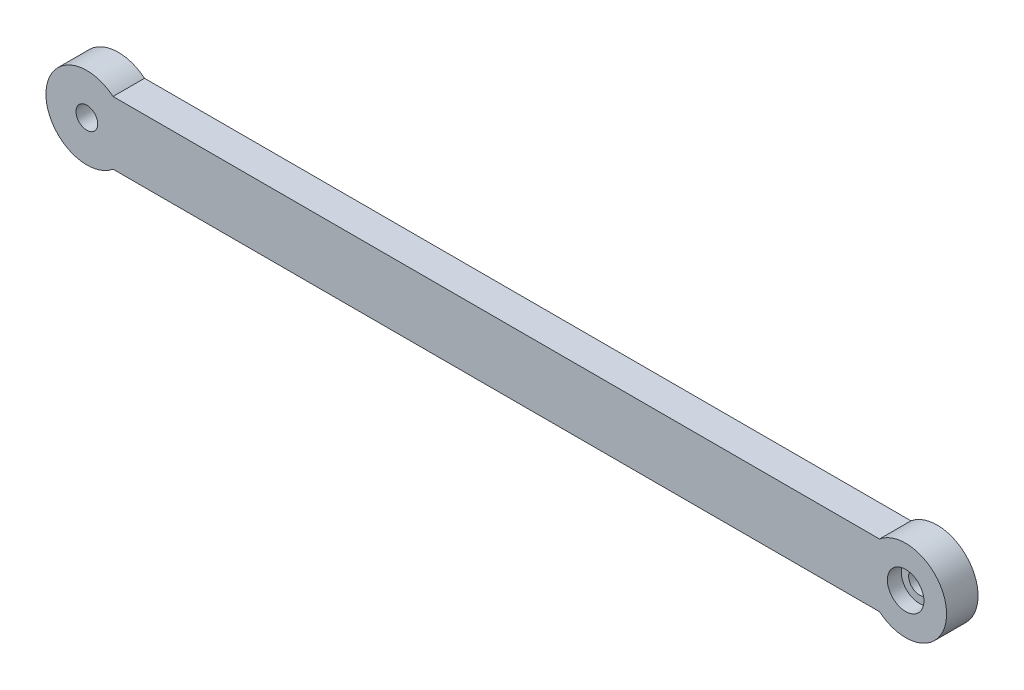
ISO-10303-21;
HEADER;
FILE_DESCRIPTION(('STEP AP214'),'2;1');
FILE_NAME('part.step','',(''),(''),'','','');
FILE_SCHEMA(('AUTOMOTIVE_DESIGN { 1 0 10303 214 1 1 1 1 }'));
ENDSEC;
DATA;
#1=APPLICATION_CONTEXT('core data for automotive mechanical design processes');
#2=APPLICATION_PROTOCOL_DEFINITION('international standard','automotive_design',2000,#1);
#3=PRODUCT_CONTEXT('',#1,'mechanical');
#4=PRODUCT('Part','Part','',(#3));
#5=PRODUCT_RELATED_PRODUCT_CATEGORY('part','',(#4));
#6=PRODUCT_DEFINITION_FORMATION('','',#4);
#7=PRODUCT_DEFINITION_CONTEXT('part definition',#1,'design');
#8=PRODUCT_DEFINITION('design','',#6,#7);
#9=PRODUCT_DEFINITION_SHAPE('','',#8);
#10=(LENGTH_UNIT() NAMED_UNIT(*) SI_UNIT(.MILLI.,.METRE.));
#11=(NAMED_UNIT(*) PLANE_ANGLE_UNIT() SI_UNIT($,.RADIAN.));
#12=(NAMED_UNIT(*) SI_UNIT($,.STERADIAN.) SOLID_ANGLE_UNIT());
#13=UNCERTAINTY_MEASURE_WITH_UNIT(LENGTH_MEASURE(1.E-05),#10,'distance_accuracy_value','');
#14=(GEOMETRIC_REPRESENTATION_CONTEXT(3) GLOBAL_UNCERTAINTY_ASSIGNED_CONTEXT((#13)) GLOBAL_UNIT_ASSIGNED_CONTEXT((#10,
#11,#12)) REPRESENTATION_CONTEXT('',''));
#15=CARTESIAN_POINT('',(0.,0.,0.));
#16=DIRECTION('',(0.,0.,1.));
#17=DIRECTION('',(1.,0.,0.));
#18=AXIS2_PLACEMENT_3D('',#15,#16,#17);
#19=CARTESIAN_POINT('',(130.,0.,-3.));
#20=DIRECTION('',(0.,0.,1.));
#21=DIRECTION('',(1.,0.,0.));
#22=AXIS2_PLACEMENT_3D('',#19,#20,#21);
#23=CYLINDRICAL_SURFACE('',#22,1.725);
#24=CARTESIAN_POINT('',(130.,0.,-3.));
#25=DIRECTION('',(0.,0.,1.));
#26=DIRECTION('',(1.,0.,0.));
#27=AXIS2_PLACEMENT_3D('',#24,#25,#26);
#28=CIRCLE('',#27,1.725);
#29=CARTESIAN_POINT('',(131.725,0.,-3.));
#30=VERTEX_POINT('',#29);
#31=EDGE_CURVE('E213',#30,#30,#28,.T.);
#32=ORIENTED_EDGE('',*,*,#31,.F.);
#33=EDGE_LOOP('',(#32));
#34=FACE_BOUND('',#33,.T.);
#35=CARTESIAN_POINT('',(130.,0.,-0.2));
#36=DIRECTION('',(0.,0.,1.));
#37=DIRECTION('',(1.,0.,0.));
#38=AXIS2_PLACEMENT_3D('',#35,#36,#37);
#39=CIRCLE('',#38,1.725);
#40=CARTESIAN_POINT('',(131.725,0.,-0.2));
#41=VERTEX_POINT('',#40);
#42=EDGE_CURVE('E43',#41,#41,#39,.F.);
#43=ORIENTED_EDGE('',*,*,#42,.F.);
#44=EDGE_LOOP('',(#43));
#45=FACE_BOUND('',#44,.T.);
#46=ADVANCED_FACE('F39',(#34,#45),#23,.F.);
#47=CARTESIAN_POINT('',(0.,-5.,2.));
#48=DIRECTION('',(0.,1.,0.));
#49=DIRECTION('',(0.,0.,1.));
#50=AXIS2_PLACEMENT_3D('',#47,#48,#49);
#51=PLANE('',#50);
#52=DIRECTION('',(0.,0.,-1.));
#53=VECTOR('',#52,1.);
#54=CARTESIAN_POINT('',(125.846688068541,-5.,2.));
#55=LINE('',#54,#53);
#56=CARTESIAN_POINT('',(125.846688068541,-5.,2.));
#57=VERTEX_POINT('',#56);
#58=CARTESIAN_POINT('',(125.846688068541,-5.,-3.));
#59=VERTEX_POINT('',#58);
#60=EDGE_CURVE('E61',#57,#59,#55,.T.);
#61=ORIENTED_EDGE('',*,*,#60,.F.);
#62=DIRECTION('',(1.,0.,0.));
#63=VECTOR('',#62,1.);
#64=CARTESIAN_POINT('',(0.,-5.,2.));
#65=LINE('',#64,#63);
#66=CARTESIAN_POINT('',(4.15331193145904,-5.,2.));
#67=VERTEX_POINT('',#66);
#68=EDGE_CURVE('E48',#67,#57,#65,.T.);
#69=ORIENTED_EDGE('',*,*,#68,.F.);
#70=DIRECTION('',(0.,0.,-1.));
#71=VECTOR('',#70,1.);
#72=CARTESIAN_POINT('',(4.15331193145904,-5.,2.));
#73=LINE('',#72,#71);
#74=CARTESIAN_POINT('',(4.15331193145904,-5.,-3.));
#75=VERTEX_POINT('',#74);
#76=EDGE_CURVE('E98',#75,#67,#73,.F.);
#77=ORIENTED_EDGE('',*,*,#76,.F.);
#78=DIRECTION('',(1.,0.,0.));
#79=VECTOR('',#78,1.);
#80=CARTESIAN_POINT('',(0.,-5.,-3.));
#81=LINE('',#80,#79);
#82=EDGE_CURVE('E90',#75,#59,#81,.T.);
#83=ORIENTED_EDGE('',*,*,#82,.T.);
#84=EDGE_LOOP('',(#61,#69,#77,#83));
#85=FACE_BOUND('',#84,.T.);
#86=ADVANCED_FACE('F41',(#85),#51,.F.);
#87=CARTESIAN_POINT('',(130.,5.,2.));
#88=DIRECTION('',(0.,-1.,0.));
#89=DIRECTION('',(0.,0.,-1.));
#90=AXIS2_PLACEMENT_3D('',#87,#88,#89);
#91=PLANE('',#90);
#92=DIRECTION('',(0.,0.,-1.));
#93=VECTOR('',#92,1.);
#94=CARTESIAN_POINT('',(125.846688068541,5.,2.));
#95=LINE('',#94,#93);
#96=CARTESIAN_POINT('',(125.846688068541,5.,-3.));
#97=VERTEX_POINT('',#96);
#98=CARTESIAN_POINT('',(125.846688068541,5.,2.));
#99=VERTEX_POINT('',#98);
#100=EDGE_CURVE('E85',#97,#99,#95,.F.);
#101=ORIENTED_EDGE('',*,*,#100,.F.);
#102=DIRECTION('',(-1.,0.,0.));
#103=VECTOR('',#102,1.);
#104=CARTESIAN_POINT('',(130.,5.,-3.));
#105=LINE('',#104,#103);
#106=CARTESIAN_POINT('',(4.15331193145904,5.,-3.));
#107=VERTEX_POINT('',#106);
#108=EDGE_CURVE('E76',#97,#107,#105,.T.);
#109=ORIENTED_EDGE('',*,*,#108,.T.);
#110=DIRECTION('',(0.,0.,-1.));
#111=VECTOR('',#110,1.);
#112=CARTESIAN_POINT('',(4.15331193145904,5.,2.));
#113=LINE('',#112,#111);
#114=CARTESIAN_POINT('',(4.15331193145904,5.,2.));
#115=VERTEX_POINT('',#114);
#116=EDGE_CURVE('E84',#115,#107,#113,.T.);
#117=ORIENTED_EDGE('',*,*,#116,.F.);
#118=DIRECTION('',(-1.,0.,0.));
#119=VECTOR('',#118,1.);
#120=CARTESIAN_POINT('',(130.,5.,2.));
#121=LINE('',#120,#119);
#122=EDGE_CURVE('E11',#99,#115,#121,.T.);
#123=ORIENTED_EDGE('',*,*,#122,.F.);
#124=EDGE_LOOP('',(#101,#109,#117,#123));
#125=FACE_BOUND('',#124,.T.);
#126=ADVANCED_FACE('F78',(#125),#91,.F.);
#127=CARTESIAN_POINT('',(0.,0.,2.));
#128=DIRECTION('',(0.,0.,1.));
#129=DIRECTION('',(1.,0.,0.));
#130=AXIS2_PLACEMENT_3D('',#127,#128,#129);
#131=PLANE('',#130);
#132=CARTESIAN_POINT('',(130.,0.,2.));
#133=DIRECTION('',(0.,0.,1.));
#134=DIRECTION('',(1.,0.,0.));
#135=AXIS2_PLACEMENT_3D('',#132,#133,#134);
#136=CIRCLE('',#135,2.90000000000001);
#137=CARTESIAN_POINT('',(132.9,0.,2.));
#138=VERTEX_POINT('',#137);
#139=EDGE_CURVE('E207',#138,#138,#136,.T.);
#140=ORIENTED_EDGE('',*,*,#139,.F.);
#141=EDGE_LOOP('',(#140));
#142=FACE_BOUND('',#141,.T.);
#143=CARTESIAN_POINT('',(0.,0.,2.));
#144=DIRECTION('',(0.,0.,1.));
#145=DIRECTION('',(1.,0.,0.));
#146=AXIS2_PLACEMENT_3D('',#143,#144,#145);
#147=CIRCLE('',#146,1.725);
#148=CARTESIAN_POINT('',(1.725,0.,2.));
#149=VERTEX_POINT('',#148);
#150=EDGE_CURVE('E116',#149,#149,#147,.T.);
#151=ORIENTED_EDGE('',*,*,#150,.F.);
#152=EDGE_LOOP('',(#151));
#153=FACE_BOUND('',#152,.T.);
#154=CARTESIAN_POINT('',(130.,0.,2.));
#155=DIRECTION('',(0.,0.,1.));
#156=DIRECTION('',(1.,0.,0.));
#157=AXIS2_PLACEMENT_3D('',#154,#155,#156);
#158=CIRCLE('',#157,6.50000000000001);
#159=EDGE_CURVE('E111',#57,#99,#158,.T.);
#160=ORIENTED_EDGE('',*,*,#159,.T.);
#161=ORIENTED_EDGE('',*,*,#122,.T.);
#162=CARTESIAN_POINT('',(0.,0.,2.));
#163=DIRECTION('',(0.,0.,1.));
#164=DIRECTION('',(1.,0.,0.));
#165=AXIS2_PLACEMENT_3D('',#162,#163,#164);
#166=CIRCLE('',#165,6.5);
#167=EDGE_CURVE('E94',#115,#67,#166,.T.);
#168=ORIENTED_EDGE('',*,*,#167,.T.);
#169=ORIENTED_EDGE('',*,*,#68,.T.);
#170=EDGE_LOOP('',(#160,#161,#168,#169));
#171=FACE_BOUND('',#170,.T.);
#172=ADVANCED_FACE('F122',(#142,#153,#171),#131,.T.);
#173=CARTESIAN_POINT('',(0.,0.,-3.));
#174=DIRECTION('',(0.,0.,1.));
#175=DIRECTION('',(1.,0.,0.));
#176=AXIS2_PLACEMENT_3D('',#173,#174,#175);
#177=PLANE('',#176);
#178=CARTESIAN_POINT('',(0.,0.,-3.));
#179=DIRECTION('',(0.,0.,1.));
#180=DIRECTION('',(1.,0.,0.));
#181=AXIS2_PLACEMENT_3D('',#178,#179,#180);
#182=CIRCLE('',#181,1.725);
#183=CARTESIAN_POINT('',(1.725,0.,-3.));
#184=VERTEX_POINT('',#183);
#185=EDGE_CURVE('E115',#184,#184,#182,.T.);
#186=ORIENTED_EDGE('',*,*,#185,.T.);
#187=EDGE_LOOP('',(#186));
#188=FACE_BOUND('',#187,.T.);
#189=ORIENTED_EDGE('',*,*,#31,.T.);
#190=EDGE_LOOP('',(#189));
#191=FACE_BOUND('',#190,.T.);
#192=ORIENTED_EDGE('',*,*,#108,.F.);
#193=CARTESIAN_POINT('',(130.,0.,-3.));
#194=DIRECTION('',(0.,0.,1.));
#195=DIRECTION('',(1.,0.,0.));
#196=AXIS2_PLACEMENT_3D('',#193,#194,#195);
#197=CIRCLE('',#196,6.50000000000001);
#198=EDGE_CURVE('E107',#59,#97,#197,.T.);
#199=ORIENTED_EDGE('',*,*,#198,.F.);
#200=ORIENTED_EDGE('',*,*,#82,.F.);
#201=CARTESIAN_POINT('',(0.,0.,-3.));
#202=DIRECTION('',(0.,0.,1.));
#203=DIRECTION('',(1.,0.,0.));
#204=AXIS2_PLACEMENT_3D('',#201,#202,#203);
#205=CIRCLE('',#204,6.5);
#206=EDGE_CURVE('E91',#107,#75,#205,.T.);
#207=ORIENTED_EDGE('',*,*,#206,.F.);
#208=EDGE_LOOP('',(#192,#199,#200,#207));
#209=FACE_BOUND('',#208,.T.);
#210=ADVANCED_FACE('F100',(#188,#191,#209),#177,.F.);
#211=CARTESIAN_POINT('',(0.,0.,2.));
#212=DIRECTION('',(0.,0.,-1.));
#213=DIRECTION('',(-1.,0.,0.));
#214=AXIS2_PLACEMENT_3D('',#211,#212,#213);
#215=CYLINDRICAL_SURFACE('',#214,6.5);
#216=ORIENTED_EDGE('',*,*,#206,.T.);
#217=ORIENTED_EDGE('',*,*,#76,.T.);
#218=ORIENTED_EDGE('',*,*,#167,.F.);
#219=ORIENTED_EDGE('',*,*,#116,.T.);
#220=EDGE_LOOP('',(#216,#217,#218,#219));
#221=FACE_BOUND('',#220,.T.);
#222=ADVANCED_FACE('F93',(#221),#215,.T.);
#223=CARTESIAN_POINT('',(130.,0.,2.));
#224=DIRECTION('',(0.,0.,-1.));
#225=DIRECTION('',(-1.,0.,0.));
#226=AXIS2_PLACEMENT_3D('',#223,#224,#225);
#227=CYLINDRICAL_SURFACE('',#226,6.50000000000001);
#228=ORIENTED_EDGE('',*,*,#159,.F.);
#229=ORIENTED_EDGE('',*,*,#60,.T.);
#230=ORIENTED_EDGE('',*,*,#198,.T.);
#231=ORIENTED_EDGE('',*,*,#100,.T.);
#232=EDGE_LOOP('',(#228,#229,#230,#231));
#233=FACE_BOUND('',#232,.T.);
#234=ADVANCED_FACE('F108',(#233),#227,.T.);
#235=CARTESIAN_POINT('',(0.,0.,-3.));
#236=DIRECTION('',(0.,0.,1.));
#237=DIRECTION('',(1.,0.,0.));
#238=AXIS2_PLACEMENT_3D('',#235,#236,#237);
#239=CYLINDRICAL_SURFACE('',#238,1.725);
#240=ORIENTED_EDGE('',*,*,#185,.F.);
#241=EDGE_LOOP('',(#240));
#242=FACE_BOUND('',#241,.T.);
#243=ORIENTED_EDGE('',*,*,#150,.T.);
#244=EDGE_LOOP('',(#243));
#245=FACE_BOUND('',#244,.T.);
#246=ADVANCED_FACE('F149',(#242,#245),#239,.F.);
#247=CARTESIAN_POINT('',(130.,0.,-0.2));
#248=DIRECTION('',(0.,0.,1.));
#249=DIRECTION('',(1.,0.,0.));
#250=AXIS2_PLACEMENT_3D('',#247,#248,#249);
#251=PLANE('',#250);
#252=CARTESIAN_POINT('',(130.,0.,-0.2));
#253=DIRECTION('',(0.,0.,1.));
#254=DIRECTION('',(1.,0.,0.));
#255=AXIS2_PLACEMENT_3D('',#252,#253,#254);
#256=CIRCLE('',#255,2.90000000000001);
#257=CARTESIAN_POINT('',(132.9,0.,-0.2));
#258=VERTEX_POINT('',#257);
#259=EDGE_CURVE('E209',#258,#258,#256,.T.);
#260=ORIENTED_EDGE('',*,*,#259,.T.);
#261=EDGE_LOOP('',(#260));
#262=FACE_BOUND('',#261,.T.);
#263=ORIENTED_EDGE('',*,*,#42,.T.);
#264=EDGE_LOOP('',(#263));
#265=FACE_BOUND('',#264,.T.);
#266=ADVANCED_FACE('F180',(#262,#265),#251,.T.);
#267=CARTESIAN_POINT('',(130.,0.,2.));
#268=DIRECTION('',(0.,0.,-1.));
#269=DIRECTION('',(-1.,0.,0.));
#270=AXIS2_PLACEMENT_3D('',#267,#268,#269);
#271=CYLINDRICAL_SURFACE('',#270,2.90000000000001);
#272=ORIENTED_EDGE('',*,*,#139,.T.);
#273=EDGE_LOOP('',(#272));
#274=FACE_BOUND('',#273,.T.);
#275=ORIENTED_EDGE('',*,*,#259,.F.);
#276=EDGE_LOOP('',(#275));
#277=FACE_BOUND('',#276,.T.);
#278=ADVANCED_FACE('F191',(#274,#277),#271,.F.);
#279=CLOSED_SHELL('',(#46,#86,#126,#172,#210,#222,#234,#246,#266,#278));
#280=MANIFOLD_SOLID_BREP('B2',#279);
#281=ADVANCED_BREP_SHAPE_REPRESENTATION('',(#18,#280),#14);
#282=SHAPE_DEFINITION_REPRESENTATION(#9,#281);
ENDSEC;
END-ISO-10303-21;
